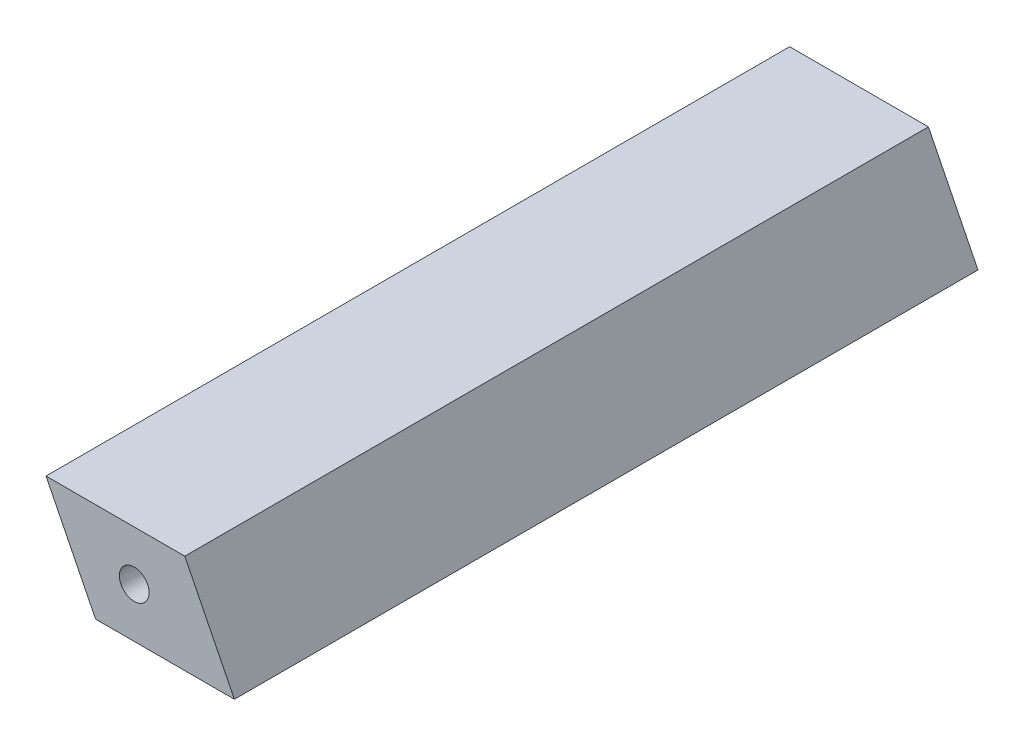
ISO-10303-21;
HEADER;
FILE_DESCRIPTION(('STEP AP214'),'2;1');
FILE_NAME('part.step','',(''),(''),'','','');
FILE_SCHEMA(('AUTOMOTIVE_DESIGN { 1 0 10303 214 1 1 1 1 }'));
ENDSEC;
DATA;
#1=APPLICATION_CONTEXT('core data for automotive mechanical design processes');
#2=APPLICATION_PROTOCOL_DEFINITION('international standard','automotive_design',2000,#1);
#3=PRODUCT_CONTEXT('',#1,'mechanical');
#4=PRODUCT('Part','Part','',(#3));
#5=PRODUCT_RELATED_PRODUCT_CATEGORY('part','',(#4));
#6=PRODUCT_DEFINITION_FORMATION('','',#4);
#7=PRODUCT_DEFINITION_CONTEXT('part definition',#1,'design');
#8=PRODUCT_DEFINITION('design','',#6,#7);
#9=PRODUCT_DEFINITION_SHAPE('','',#8);
#10=(LENGTH_UNIT() NAMED_UNIT(*) SI_UNIT(.MILLI.,.METRE.));
#11=(NAMED_UNIT(*) PLANE_ANGLE_UNIT() SI_UNIT($,.RADIAN.));
#12=(NAMED_UNIT(*) SI_UNIT($,.STERADIAN.) SOLID_ANGLE_UNIT());
#13=UNCERTAINTY_MEASURE_WITH_UNIT(LENGTH_MEASURE(1.E-05),#10,'distance_accuracy_value','');
#14=(GEOMETRIC_REPRESENTATION_CONTEXT(3) GLOBAL_UNCERTAINTY_ASSIGNED_CONTEXT((#13)) GLOBAL_UNIT_ASSIGNED_CONTEXT((#10,
#11,#12)) REPRESENTATION_CONTEXT('',''));
#15=CARTESIAN_POINT('',(0.,0.,0.));
#16=DIRECTION('',(0.,0.,1.));
#17=DIRECTION('',(1.,0.,0.));
#18=AXIS2_PLACEMENT_3D('',#15,#16,#17);
#19=CARTESIAN_POINT('',(-2.54054849385245,5.08,-38.1));
#20=DIRECTION('',(-0.894388560370081,-0.447290848418715,0.));
#21=DIRECTION('',(0.447290848418715,-0.894388560370081,0.));
#22=AXIS2_PLACEMENT_3D('',#19,#20,#21);
#23=PLANE('',#22);
#24=DIRECTION('',(0.447290848418715,-0.894388560370081,0.));
#25=VECTOR('',#24,1.);
#26=CARTESIAN_POINT('',(-2.54054849385245,5.08,0.));
#27=LINE('',#26,#25);
#28=CARTESIAN_POINT('',(-2.54054849385245,5.08,0.));
#29=VERTEX_POINT('',#28);
#30=CARTESIAN_POINT('',(0.,0.,0.));
#31=VERTEX_POINT('',#30);
#32=EDGE_CURVE('E98',#29,#31,#27,.T.);
#33=ORIENTED_EDGE('',*,*,#32,.F.);
#34=DIRECTION('',(0.,0.,1.));
#35=VECTOR('',#34,1.);
#36=CARTESIAN_POINT('',(-2.54054849385245,5.08,-38.1));
#37=LINE('',#36,#35);
#38=CARTESIAN_POINT('',(-2.54054849385245,5.08,-38.1));
#39=VERTEX_POINT('',#38);
#40=EDGE_CURVE('E11',#39,#29,#37,.T.);
#41=ORIENTED_EDGE('',*,*,#40,.F.);
#42=DIRECTION('',(0.447290848418715,-0.894388560370081,0.));
#43=VECTOR('',#42,1.);
#44=CARTESIAN_POINT('',(-2.54054849385245,5.08,-38.1));
#45=LINE('',#44,#43);
#46=CARTESIAN_POINT('',(0.,0.,-38.1));
#47=VERTEX_POINT('',#46);
#48=EDGE_CURVE('E91',#39,#47,#45,.T.);
#49=ORIENTED_EDGE('',*,*,#48,.T.);
#50=DIRECTION('',(0.,0.,1.));
#51=VECTOR('',#50,1.);
#52=CARTESIAN_POINT('',(0.,0.,-38.1));
#53=LINE('',#52,#51);
#54=EDGE_CURVE('E36',#47,#31,#53,.T.);
#55=ORIENTED_EDGE('',*,*,#54,.T.);
#56=EDGE_LOOP('',(#33,#41,#49,#55));
#57=FACE_BOUND('',#56,.T.);
#58=ADVANCED_FACE('F33',(#57),#23,.T.);
#59=CARTESIAN_POINT('',(4.57145150614755,5.08,-38.1));
#60=DIRECTION('',(0.,1.,0.));
#61=DIRECTION('',(-1.,0.,0.));
#62=AXIS2_PLACEMENT_3D('',#59,#60,#61);
#63=PLANE('',#62);
#64=DIRECTION('',(-1.,0.,0.));
#65=VECTOR('',#64,1.);
#66=CARTESIAN_POINT('',(4.57145150614755,5.08,0.));
#67=LINE('',#66,#65);
#68=CARTESIAN_POINT('',(4.57145150614755,5.08,0.));
#69=VERTEX_POINT('',#68);
#70=EDGE_CURVE('E93',#69,#29,#67,.T.);
#71=ORIENTED_EDGE('',*,*,#70,.F.);
#72=DIRECTION('',(0.,0.,1.));
#73=VECTOR('',#72,1.);
#74=CARTESIAN_POINT('',(4.57145150614755,5.08,-38.1));
#75=LINE('',#74,#73);
#76=CARTESIAN_POINT('',(4.57145150614755,5.08,-38.1));
#77=VERTEX_POINT('',#76);
#78=EDGE_CURVE('E42',#77,#69,#75,.T.);
#79=ORIENTED_EDGE('',*,*,#78,.F.);
#80=DIRECTION('',(-1.,0.,0.));
#81=VECTOR('',#80,1.);
#82=CARTESIAN_POINT('',(4.57145150614755,5.08,-38.1));
#83=LINE('',#82,#81);
#84=EDGE_CURVE('E88',#77,#39,#83,.T.);
#85=ORIENTED_EDGE('',*,*,#84,.T.);
#86=ORIENTED_EDGE('',*,*,#40,.T.);
#87=EDGE_LOOP('',(#71,#79,#85,#86));
#88=FACE_BOUND('',#87,.T.);
#89=ADVANCED_FACE('F109',(#88),#63,.T.);
#90=CARTESIAN_POINT('',(4.57145150614755,5.08,-38.1));
#91=DIRECTION('',(0.894388560370081,0.447290848418715,0.));
#92=DIRECTION('',(-0.447290848418715,0.894388560370081,0.));
#93=AXIS2_PLACEMENT_3D('',#90,#91,#92);
#94=PLANE('',#93);
#95=DIRECTION('',(-0.447290848418715,0.894388560370081,0.));
#96=VECTOR('',#95,1.);
#97=CARTESIAN_POINT('',(4.57145150614755,5.08,0.));
#98=LINE('',#97,#96);
#99=CARTESIAN_POINT('',(7.112,0.,0.));
#100=VERTEX_POINT('',#99);
#101=EDGE_CURVE('E83',#100,#69,#98,.T.);
#102=ORIENTED_EDGE('',*,*,#101,.F.);
#103=DIRECTION('',(0.,0.,1.));
#104=VECTOR('',#103,1.);
#105=CARTESIAN_POINT('',(7.112,0.,-38.1));
#106=LINE('',#105,#104);
#107=CARTESIAN_POINT('',(7.112,0.,-38.1));
#108=VERTEX_POINT('',#107);
#109=EDGE_CURVE('E78',#108,#100,#106,.T.);
#110=ORIENTED_EDGE('',*,*,#109,.F.);
#111=DIRECTION('',(-0.447290848418715,0.894388560370081,0.));
#112=VECTOR('',#111,1.);
#113=CARTESIAN_POINT('',(4.57145150614755,5.08,-38.1));
#114=LINE('',#113,#112);
#115=EDGE_CURVE('E81',#108,#77,#114,.T.);
#116=ORIENTED_EDGE('',*,*,#115,.T.);
#117=ORIENTED_EDGE('',*,*,#78,.T.);
#118=EDGE_LOOP('',(#102,#110,#116,#117));
#119=FACE_BOUND('',#118,.T.);
#120=ADVANCED_FACE('F80',(#119),#94,.T.);
#121=CARTESIAN_POINT('',(0.,0.,-38.1));
#122=DIRECTION('',(0.,-1.,0.));
#123=DIRECTION('',(0.,0.,-1.));
#124=AXIS2_PLACEMENT_3D('',#121,#122,#123);
#125=PLANE('',#124);
#126=DIRECTION('',(1.,0.,0.));
#127=VECTOR('',#126,1.);
#128=CARTESIAN_POINT('',(0.,0.,0.));
#129=LINE('',#128,#127);
#130=EDGE_CURVE('E101',#31,#100,#129,.T.);
#131=ORIENTED_EDGE('',*,*,#130,.F.);
#132=ORIENTED_EDGE('',*,*,#54,.F.);
#133=DIRECTION('',(1.,0.,0.));
#134=VECTOR('',#133,1.);
#135=CARTESIAN_POINT('',(0.,0.,-38.1));
#136=LINE('',#135,#134);
#137=EDGE_CURVE('E87',#47,#108,#136,.T.);
#138=ORIENTED_EDGE('',*,*,#137,.T.);
#139=ORIENTED_EDGE('',*,*,#109,.T.);
#140=EDGE_LOOP('',(#131,#132,#138,#139));
#141=FACE_BOUND('',#140,.T.);
#142=ADVANCED_FACE('F90',(#141),#125,.T.);
#143=CARTESIAN_POINT('',(0.,0.,-38.1));
#144=DIRECTION('',(0.,0.,1.));
#145=DIRECTION('',(1.,0.,0.));
#146=AXIS2_PLACEMENT_3D('',#143,#144,#145);
#147=PLANE('',#146);
#148=CARTESIAN_POINT('',(1.97912108307377,2.54,-38.1));
#149=DIRECTION('',(0.,0.,-1.));
#150=DIRECTION('',(-1.,0.,0.));
#151=AXIS2_PLACEMENT_3D('',#148,#149,#150);
#152=CIRCLE('',#151,0.762000000000001);
#153=CARTESIAN_POINT('',(1.21712108307377,2.54,-38.1));
#154=VERTEX_POINT('',#153);
#155=EDGE_CURVE('E151',#154,#154,#152,.T.);
#156=ORIENTED_EDGE('',*,*,#155,.F.);
#157=EDGE_LOOP('',(#156));
#158=FACE_BOUND('',#157,.T.);
#159=ORIENTED_EDGE('',*,*,#48,.F.);
#160=ORIENTED_EDGE('',*,*,#84,.F.);
#161=ORIENTED_EDGE('',*,*,#115,.F.);
#162=ORIENTED_EDGE('',*,*,#137,.F.);
#163=EDGE_LOOP('',(#159,#160,#161,#162));
#164=FACE_BOUND('',#163,.T.);
#165=ADVANCED_FACE('F86',(#158,#164),#147,.F.);
#166=CARTESIAN_POINT('',(0.,0.,0.));
#167=DIRECTION('',(0.,0.,1.));
#168=DIRECTION('',(1.,0.,0.));
#169=AXIS2_PLACEMENT_3D('',#166,#167,#168);
#170=PLANE('',#169);
#171=CARTESIAN_POINT('',(1.97912108307377,2.54,0.));
#172=DIRECTION('',(0.,0.,1.));
#173=DIRECTION('',(1.,0.,0.));
#174=AXIS2_PLACEMENT_3D('',#171,#172,#173);
#175=CIRCLE('',#174,0.762);
#176=CARTESIAN_POINT('',(2.74112108307377,2.54,0.));
#177=VERTEX_POINT('',#176);
#178=EDGE_CURVE('E150',#177,#177,#175,.T.);
#179=ORIENTED_EDGE('',*,*,#178,.F.);
#180=EDGE_LOOP('',(#179));
#181=FACE_BOUND('',#180,.T.);
#182=ORIENTED_EDGE('',*,*,#32,.T.);
#183=ORIENTED_EDGE('',*,*,#130,.T.);
#184=ORIENTED_EDGE('',*,*,#101,.T.);
#185=ORIENTED_EDGE('',*,*,#70,.T.);
#186=EDGE_LOOP('',(#182,#183,#184,#185));
#187=FACE_BOUND('',#186,.T.);
#188=ADVANCED_FACE('F108',(#181,#187),#170,.T.);
#189=CARTESIAN_POINT('',(1.97912108307377,2.54,-7.62));
#190=DIRECTION('',(0.,0.,1.));
#191=DIRECTION('',(1.,0.,0.));
#192=AXIS2_PLACEMENT_3D('',#189,#190,#191);
#193=CYLINDRICAL_SURFACE('',#192,0.762);
#194=CARTESIAN_POINT('',(1.97912108307377,2.54,-7.62));
#195=DIRECTION('',(0.,0.,1.));
#196=DIRECTION('',(1.,0.,0.));
#197=AXIS2_PLACEMENT_3D('',#194,#195,#196);
#198=CIRCLE('',#197,0.762);
#199=CARTESIAN_POINT('',(2.74112108307377,2.54,-7.62));
#200=VERTEX_POINT('',#199);
#201=EDGE_CURVE('E102',#200,#200,#198,.T.);
#202=CARTESIAN_POINT('',(2.74112108307377,2.54,-7.62));
#203=CARTESIAN_POINT('',(2.74112108307377,2.54,-7.540625));
#204=CARTESIAN_POINT('',(2.74112108307377,2.54,-7.46125));
#205=CARTESIAN_POINT('',(2.74112108307377,2.54,-7.3025));
#206=CARTESIAN_POINT('',(2.74112108307377,2.54,-7.223125));
#207=CARTESIAN_POINT('',(2.74112108307377,2.54,-7.064375));
#208=CARTESIAN_POINT('',(2.74112108307377,2.54,-6.985));
#209=CARTESIAN_POINT('',(2.74112108307377,2.54,-6.82625));
#210=CARTESIAN_POINT('',(2.74112108307377,2.54,-6.746875));
#211=CARTESIAN_POINT('',(2.74112108307377,2.54,-6.588125));
#212=CARTESIAN_POINT('',(2.74112108307377,2.54,-6.50875));
#213=CARTESIAN_POINT('',(2.74112108307377,2.54,-6.35));
#214=CARTESIAN_POINT('',(2.74112108307377,2.54,-6.270625));
#215=CARTESIAN_POINT('',(2.74112108307377,2.54,-6.111875));
#216=CARTESIAN_POINT('',(2.74112108307377,2.54,-6.0325));
#217=CARTESIAN_POINT('',(2.74112108307377,2.54,-5.87375));
#218=CARTESIAN_POINT('',(2.74112108307377,2.54,-5.794375));
#219=CARTESIAN_POINT('',(2.74112108307377,2.54,-5.635625));
#220=CARTESIAN_POINT('',(2.74112108307377,2.54,-5.55625));
#221=CARTESIAN_POINT('',(2.74112108307377,2.54,-5.3975));
#222=CARTESIAN_POINT('',(2.74112108307377,2.54,-5.318125));
#223=CARTESIAN_POINT('',(2.74112108307377,2.54,-5.159375));
#224=CARTESIAN_POINT('',(2.74112108307377,2.54,-5.08));
#225=CARTESIAN_POINT('',(2.74112108307377,2.54,-4.92125));
#226=CARTESIAN_POINT('',(2.74112108307377,2.54,-4.841875));
#227=CARTESIAN_POINT('',(2.74112108307377,2.54,-4.683125));
#228=CARTESIAN_POINT('',(2.74112108307377,2.54,-4.60375));
#229=CARTESIAN_POINT('',(2.74112108307377,2.54,-4.445));
#230=CARTESIAN_POINT('',(2.74112108307377,2.54,-4.365625));
#231=CARTESIAN_POINT('',(2.74112108307377,2.54,-4.206875));
#232=CARTESIAN_POINT('',(2.74112108307377,2.54,-4.1275));
#233=CARTESIAN_POINT('',(2.74112108307377,2.54,-3.96875));
#234=CARTESIAN_POINT('',(2.74112108307377,2.54,-3.889375));
#235=CARTESIAN_POINT('',(2.74112108307377,2.54,-3.730625));
#236=CARTESIAN_POINT('',(2.74112108307377,2.54,-3.65125));
#237=CARTESIAN_POINT('',(2.74112108307377,2.54,-3.4925));
#238=CARTESIAN_POINT('',(2.74112108307377,2.54,-3.413125));
#239=CARTESIAN_POINT('',(2.74112108307377,2.54,-3.254375));
#240=CARTESIAN_POINT('',(2.74112108307377,2.54,-3.175));
#241=CARTESIAN_POINT('',(2.74112108307377,2.54,-3.01625));
#242=CARTESIAN_POINT('',(2.74112108307377,2.54,-2.936875));
#243=CARTESIAN_POINT('',(2.74112108307377,2.54,-2.778125));
#244=CARTESIAN_POINT('',(2.74112108307377,2.54,-2.69875));
#245=CARTESIAN_POINT('',(2.74112108307377,2.54,-2.54));
#246=CARTESIAN_POINT('',(2.74112108307377,2.54,-2.460625));
#247=CARTESIAN_POINT('',(2.74112108307377,2.54,-2.301875));
#248=CARTESIAN_POINT('',(2.74112108307377,2.54,-2.2225));
#249=CARTESIAN_POINT('',(2.74112108307377,2.54,-2.06375));
#250=CARTESIAN_POINT('',(2.74112108307377,2.54,-1.984375));
#251=CARTESIAN_POINT('',(2.74112108307377,2.54,-1.825625));
#252=CARTESIAN_POINT('',(2.74112108307377,2.54,-1.74625));
#253=CARTESIAN_POINT('',(2.74112108307377,2.54,-1.5875));
#254=CARTESIAN_POINT('',(2.74112108307377,2.54,-1.508125));
#255=CARTESIAN_POINT('',(2.74112108307377,2.54,-1.349375));
#256=CARTESIAN_POINT('',(2.74112108307377,2.54,-1.27));
#257=CARTESIAN_POINT('',(2.74112108307377,2.54,-1.11125));
#258=CARTESIAN_POINT('',(2.74112108307377,2.54,-1.031875));
#259=CARTESIAN_POINT('',(2.74112108307377,2.54,-0.873125));
#260=CARTESIAN_POINT('',(2.74112108307377,2.54,-0.79375));
#261=CARTESIAN_POINT('',(2.74112108307377,2.54,-0.635));
#262=CARTESIAN_POINT('',(2.74112108307377,2.54,-0.555625));
#263=CARTESIAN_POINT('',(2.74112108307377,2.54,-0.396875));
#264=CARTESIAN_POINT('',(2.74112108307377,2.54,-0.3175));
#265=CARTESIAN_POINT('',(2.74112108307377,2.54,-0.15875));
#266=CARTESIAN_POINT('',(2.74112108307377,2.54,-0.0793749999999999));
#267=CARTESIAN_POINT('',(2.74112108307377,2.54,0.));
#268=B_SPLINE_CURVE_WITH_KNOTS('',3,(#202,#203,#204,#205,#206,#207,#208,#209,#210,#211,#212,
#213,#214,#215,#216,#217,#218,#219,#220,#221,#222,#223,#224,#225,#226,#227,#228,#229,#230,#231,
#232,#233,#234,#235,#236,#237,#238,#239,#240,#241,#242,#243,#244,#245,#246,#247,#248,#249,#250,
#251,#252,#253,#254,#255,#256,#257,#258,#259,#260,#261,#262,#263,#264,#265,#266,#267),
.UNSPECIFIED.,.F.,.F.,(4,2,2,2,2,2,2,2,2,2,2,2,2,2,2,2,2,2,2,2,2,2,2,2,2,2,2,2,2,2,2,2,4),(0.,
0.238125,0.476249999999999,0.714375,0.952499999999999,1.190625,1.42875,1.666875,1.905,2.143125,
2.38125,2.619375,2.8575,3.095625,3.33375,3.571875,3.81,4.048125,4.28625,4.524375,4.7625,
5.000625,5.23875,5.476875,5.715,5.953125,6.19125,6.429375,6.6675,6.905625,7.14375,7.381875,
7.62),.UNSPECIFIED.);
#269=EDGE_CURVE('BSEAM127',#200,#177,#268,.T.);
#270=ORIENTED_EDGE('',*,*,#201,.F.);
#271=ORIENTED_EDGE('',*,*,#178,.T.);
#272=ORIENTED_EDGE('',*,*,#269,.T.);
#273=ORIENTED_EDGE('',*,*,#269,.F.);
#274=EDGE_LOOP('',(#270,#272,#271,#273));
#275=FACE_BOUND('',#274,.T.);
#276=ADVANCED_FACE('F127',(#275),#193,.F.);
#277=CARTESIAN_POINT('',(1.97912108307377,2.54,-7.62));
#278=DIRECTION('',(0.,0.,1.));
#279=DIRECTION('',(1.,0.,0.));
#280=AXIS2_PLACEMENT_3D('',#277,#278,#279);
#281=PLANE('',#280);
#282=ORIENTED_EDGE('',*,*,#201,.T.);
#283=EDGE_LOOP('',(#282));
#284=FACE_BOUND('',#283,.T.);
#285=ADVANCED_FACE('F133',(#284),#281,.T.);
#286=CARTESIAN_POINT('',(1.97912108307377,2.54,-30.48));
#287=DIRECTION('',(0.,0.,-1.));
#288=DIRECTION('',(-1.,0.,0.));
#289=AXIS2_PLACEMENT_3D('',#286,#287,#288);
#290=CYLINDRICAL_SURFACE('',#289,0.762000000000001);
#291=CARTESIAN_POINT('',(1.97912108307377,2.54,-30.48));
#292=DIRECTION('',(0.,0.,-1.));
#293=DIRECTION('',(-1.,0.,0.));
#294=AXIS2_PLACEMENT_3D('',#291,#292,#293);
#295=CIRCLE('',#294,0.762000000000001);
#296=CARTESIAN_POINT('',(1.21712108307377,2.54,-30.48));
#297=VERTEX_POINT('',#296);
#298=EDGE_CURVE('E149',#297,#297,#295,.T.);
#299=CARTESIAN_POINT('',(1.21712108307377,2.54,-30.48));
#300=CARTESIAN_POINT('',(1.21712108307377,2.54,-30.559375));
#301=CARTESIAN_POINT('',(1.21712108307377,2.54,-30.63875));
#302=CARTESIAN_POINT('',(1.21712108307377,2.54,-30.7975));
#303=CARTESIAN_POINT('',(1.21712108307377,2.54,-30.876875));
#304=CARTESIAN_POINT('',(1.21712108307377,2.54,-31.035625));
#305=CARTESIAN_POINT('',(1.21712108307377,2.54,-31.115));
#306=CARTESIAN_POINT('',(1.21712108307377,2.54,-31.27375));
#307=CARTESIAN_POINT('',(1.21712108307377,2.54,-31.353125));
#308=CARTESIAN_POINT('',(1.21712108307377,2.54,-31.511875));
#309=CARTESIAN_POINT('',(1.21712108307377,2.54,-31.59125));
#310=CARTESIAN_POINT('',(1.21712108307377,2.54,-31.75));
#311=CARTESIAN_POINT('',(1.21712108307377,2.54,-31.829375));
#312=CARTESIAN_POINT('',(1.21712108307377,2.54,-31.988125));
#313=CARTESIAN_POINT('',(1.21712108307377,2.54,-32.0675));
#314=CARTESIAN_POINT('',(1.21712108307377,2.54,-32.22625));
#315=CARTESIAN_POINT('',(1.21712108307377,2.54,-32.305625));
#316=CARTESIAN_POINT('',(1.21712108307377,2.54,-32.464375));
#317=CARTESIAN_POINT('',(1.21712108307377,2.54,-32.54375));
#318=CARTESIAN_POINT('',(1.21712108307377,2.54,-32.7025));
#319=CARTESIAN_POINT('',(1.21712108307377,2.54,-32.781875));
#320=CARTESIAN_POINT('',(1.21712108307377,2.54,-32.940625));
#321=CARTESIAN_POINT('',(1.21712108307377,2.54,-33.02));
#322=CARTESIAN_POINT('',(1.21712108307377,2.54,-33.17875));
#323=CARTESIAN_POINT('',(1.21712108307377,2.54,-33.258125));
#324=CARTESIAN_POINT('',(1.21712108307377,2.54,-33.416875));
#325=CARTESIAN_POINT('',(1.21712108307377,2.54,-33.49625));
#326=CARTESIAN_POINT('',(1.21712108307377,2.54,-33.655));
#327=CARTESIAN_POINT('',(1.21712108307377,2.54,-33.734375));
#328=CARTESIAN_POINT('',(1.21712108307377,2.54,-33.893125));
#329=CARTESIAN_POINT('',(1.21712108307377,2.54,-33.9725));
#330=CARTESIAN_POINT('',(1.21712108307377,2.54,-34.13125));
#331=CARTESIAN_POINT('',(1.21712108307377,2.54,-34.210625));
#332=CARTESIAN_POINT('',(1.21712108307377,2.54,-34.369375));
#333=CARTESIAN_POINT('',(1.21712108307377,2.54,-34.44875));
#334=CARTESIAN_POINT('',(1.21712108307377,2.54,-34.6075));
#335=CARTESIAN_POINT('',(1.21712108307377,2.54,-34.686875));
#336=CARTESIAN_POINT('',(1.21712108307377,2.54,-34.845625));
#337=CARTESIAN_POINT('',(1.21712108307377,2.54,-34.925));
#338=CARTESIAN_POINT('',(1.21712108307377,2.54,-35.08375));
#339=CARTESIAN_POINT('',(1.21712108307377,2.54,-35.163125));
#340=CARTESIAN_POINT('',(1.21712108307377,2.54,-35.321875));
#341=CARTESIAN_POINT('',(1.21712108307377,2.54,-35.40125));
#342=CARTESIAN_POINT('',(1.21712108307377,2.54,-35.56));
#343=CARTESIAN_POINT('',(1.21712108307377,2.54,-35.639375));
#344=CARTESIAN_POINT('',(1.21712108307377,2.54,-35.798125));
#345=CARTESIAN_POINT('',(1.21712108307377,2.54,-35.8775));
#346=CARTESIAN_POINT('',(1.21712108307377,2.54,-36.03625));
#347=CARTESIAN_POINT('',(1.21712108307377,2.54,-36.115625));
#348=CARTESIAN_POINT('',(1.21712108307377,2.54,-36.274375));
#349=CARTESIAN_POINT('',(1.21712108307377,2.54,-36.35375));
#350=CARTESIAN_POINT('',(1.21712108307377,2.54,-36.5125));
#351=CARTESIAN_POINT('',(1.21712108307377,2.54,-36.591875));
#352=CARTESIAN_POINT('',(1.21712108307377,2.54,-36.750625));
#353=CARTESIAN_POINT('',(1.21712108307377,2.54,-36.83));
#354=CARTESIAN_POINT('',(1.21712108307377,2.54,-36.98875));
#355=CARTESIAN_POINT('',(1.21712108307377,2.54,-37.068125));
#356=CARTESIAN_POINT('',(1.21712108307377,2.54,-37.226875));
#357=CARTESIAN_POINT('',(1.21712108307377,2.54,-37.30625));
#358=CARTESIAN_POINT('',(1.21712108307377,2.54,-37.465));
#359=CARTESIAN_POINT('',(1.21712108307377,2.54,-37.544375));
#360=CARTESIAN_POINT('',(1.21712108307377,2.54,-37.703125));
#361=CARTESIAN_POINT('',(1.21712108307377,2.54,-37.7825));
#362=CARTESIAN_POINT('',(1.21712108307377,2.54,-37.94125));
#363=CARTESIAN_POINT('',(1.21712108307377,2.54,-38.020625));
#364=CARTESIAN_POINT('',(1.21712108307377,2.54,-38.1));
#365=B_SPLINE_CURVE_WITH_KNOTS('',3,(#299,#300,#301,#302,#303,#304,#305,#306,#307,#308,#309,
#310,#311,#312,#313,#314,#315,#316,#317,#318,#319,#320,#321,#322,#323,#324,#325,#326,#327,#328,
#329,#330,#331,#332,#333,#334,#335,#336,#337,#338,#339,#340,#341,#342,#343,#344,#345,#346,#347,
#348,#349,#350,#351,#352,#353,#354,#355,#356,#357,#358,#359,#360,#361,#362,#363,#364),
.UNSPECIFIED.,.F.,.F.,(4,2,2,2,2,2,2,2,2,2,2,2,2,2,2,2,2,2,2,2,2,2,2,2,2,2,2,2,2,2,2,2,4),(0.,
0.238124999999999,0.476249999999998,0.714375,0.952499999999998,1.190625,1.42875,
1.66687499999999,1.905,2.143125,2.38125,2.619375,2.8575,3.09562499999999,3.33375,3.571875,3.81,
4.048125,4.28624999999999,4.52437499999999,4.7625,5.000625,5.23875,5.476875,5.71499999999999,
5.95312499999999,6.19125,6.429375,6.6675,6.905625,7.14374999999999,7.381875,7.62),.UNSPECIFIED.);
#366=EDGE_CURVE('BSEAM137',#297,#154,#365,.T.);
#367=ORIENTED_EDGE('',*,*,#298,.F.);
#368=ORIENTED_EDGE('',*,*,#155,.T.);
#369=ORIENTED_EDGE('',*,*,#366,.T.);
#370=ORIENTED_EDGE('',*,*,#366,.F.);
#371=EDGE_LOOP('',(#367,#369,#368,#370));
#372=FACE_BOUND('',#371,.T.);
#373=ADVANCED_FACE('F137',(#372),#290,.F.);
#374=CARTESIAN_POINT('',(1.97912108307377,2.54,-30.48));
#375=DIRECTION('',(0.,0.,-1.));
#376=DIRECTION('',(-1.,0.,0.));
#377=AXIS2_PLACEMENT_3D('',#374,#375,#376);
#378=PLANE('',#377);
#379=ORIENTED_EDGE('',*,*,#298,.T.);
#380=EDGE_LOOP('',(#379));
#381=FACE_BOUND('',#380,.T.);
#382=ADVANCED_FACE('F141',(#381),#378,.T.);
#383=CLOSED_SHELL('',(#58,#89,#120,#142,#165,#188,#276,#285,#373,#382));
#384=MANIFOLD_SOLID_BREP('B2',#383);
#385=ADVANCED_BREP_SHAPE_REPRESENTATION('',(#18,#384),#14);
#386=SHAPE_DEFINITION_REPRESENTATION(#9,#385);
ENDSEC;
END-ISO-10303-21;
